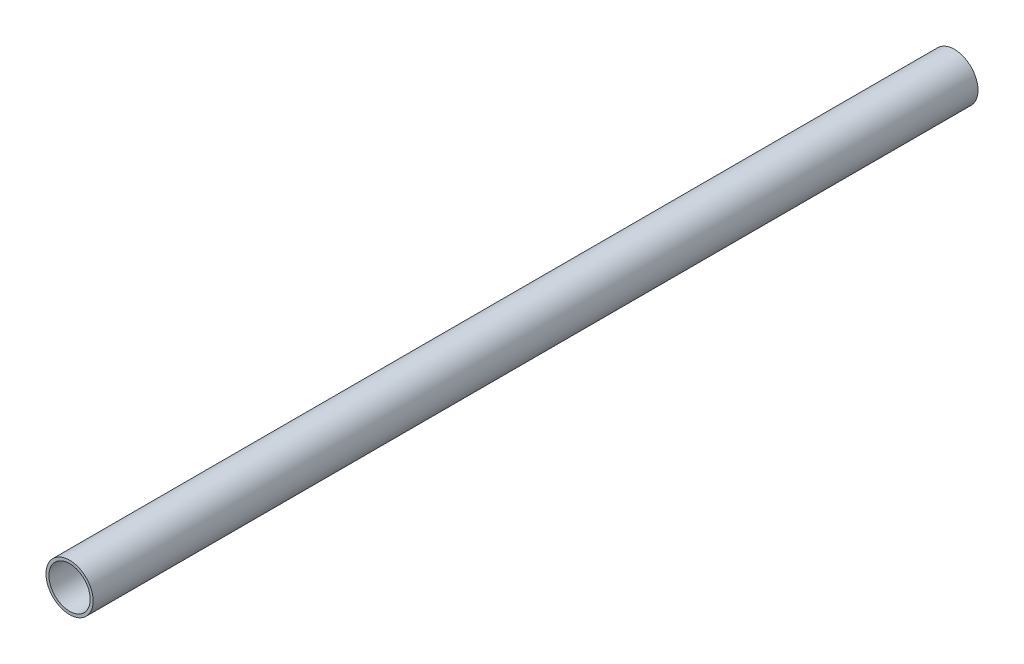
ISO-10303-21;
HEADER;
FILE_DESCRIPTION(('STEP AP214'),'2;1');
FILE_NAME('part.step','',(''),(''),'','','');
FILE_SCHEMA(('AUTOMOTIVE_DESIGN { 1 0 10303 214 1 1 1 1 }'));
ENDSEC;
DATA;
#1=APPLICATION_CONTEXT('core data for automotive mechanical design processes');
#2=APPLICATION_PROTOCOL_DEFINITION('international standard','automotive_design',2000,#1);
#3=PRODUCT_CONTEXT('',#1,'mechanical');
#4=PRODUCT('Part','Part','',(#3));
#5=PRODUCT_RELATED_PRODUCT_CATEGORY('part','',(#4));
#6=PRODUCT_DEFINITION_FORMATION('','',#4);
#7=PRODUCT_DEFINITION_CONTEXT('part definition',#1,'design');
#8=PRODUCT_DEFINITION('design','',#6,#7);
#9=PRODUCT_DEFINITION_SHAPE('','',#8);
#10=(LENGTH_UNIT() NAMED_UNIT(*) SI_UNIT(.MILLI.,.METRE.));
#11=(NAMED_UNIT(*) PLANE_ANGLE_UNIT() SI_UNIT($,.RADIAN.));
#12=(NAMED_UNIT(*) SI_UNIT($,.STERADIAN.) SOLID_ANGLE_UNIT());
#13=UNCERTAINTY_MEASURE_WITH_UNIT(LENGTH_MEASURE(1.E-05),#10,'distance_accuracy_value','');
#14=(GEOMETRIC_REPRESENTATION_CONTEXT(3) GLOBAL_UNCERTAINTY_ASSIGNED_CONTEXT((#13)) GLOBAL_UNIT_ASSIGNED_CONTEXT((#10,
#11,#12)) REPRESENTATION_CONTEXT('',''));
#15=CARTESIAN_POINT('',(0.,0.,0.));
#16=DIRECTION('',(0.,0.,1.));
#17=DIRECTION('',(1.,0.,0.));
#18=AXIS2_PLACEMENT_3D('',#15,#16,#17);
#19=CARTESIAN_POINT('',(0.,0.,75.));
#20=DIRECTION('',(0.,0.,1.));
#21=DIRECTION('',(1.,0.,0.));
#22=AXIS2_PLACEMENT_3D('',#19,#20,#21);
#23=PLANE('',#22);
#24=CARTESIAN_POINT('',(0.,0.,75.));
#25=DIRECTION('',(0.,0.,1.));
#26=DIRECTION('',(1.,0.,0.));
#27=AXIS2_PLACEMENT_3D('',#24,#25,#26);
#28=CIRCLE('',#27,4.);
#29=CARTESIAN_POINT('',(4.,0.,75.));
#30=VERTEX_POINT('',#29);
#31=EDGE_CURVE('E10',#30,#30,#28,.T.);
#32=ORIENTED_EDGE('',*,*,#31,.T.);
#33=EDGE_LOOP('',(#32));
#34=FACE_BOUND('',#33,.T.);
#35=CARTESIAN_POINT('',(0.,0.,75.));
#36=DIRECTION('',(0.,0.,1.));
#37=DIRECTION('',(1.,0.,0.));
#38=AXIS2_PLACEMENT_3D('',#35,#36,#37);
#39=CIRCLE('',#38,3.5);
#40=CARTESIAN_POINT('',(3.5,0.,75.));
#41=VERTEX_POINT('',#40);
#42=EDGE_CURVE('E42',#41,#41,#39,.T.);
#43=ORIENTED_EDGE('',*,*,#42,.F.);
#44=EDGE_LOOP('',(#43));
#45=FACE_BOUND('',#44,.T.);
#46=ADVANCED_FACE('F31',(#34,#45),#23,.T.);
#47=CARTESIAN_POINT('',(0.,0.,-75.));
#48=DIRECTION('',(0.,0.,1.));
#49=DIRECTION('',(1.,0.,0.));
#50=AXIS2_PLACEMENT_3D('',#47,#48,#49);
#51=PLANE('',#50);
#52=CARTESIAN_POINT('',(0.,0.,-75.));
#53=DIRECTION('',(0.,0.,1.));
#54=DIRECTION('',(1.,0.,0.));
#55=AXIS2_PLACEMENT_3D('',#52,#53,#54);
#56=CIRCLE('',#55,4.);
#57=CARTESIAN_POINT('',(4.,0.,-75.));
#58=VERTEX_POINT('',#57);
#59=EDGE_CURVE('E35',#58,#58,#56,.T.);
#60=ORIENTED_EDGE('',*,*,#59,.F.);
#61=EDGE_LOOP('',(#60));
#62=FACE_BOUND('',#61,.T.);
#63=CARTESIAN_POINT('',(0.,0.,-75.));
#64=DIRECTION('',(0.,0.,1.));
#65=DIRECTION('',(1.,0.,0.));
#66=AXIS2_PLACEMENT_3D('',#63,#64,#65);
#67=CIRCLE('',#66,3.5);
#68=CARTESIAN_POINT('',(3.5,0.,-75.));
#69=VERTEX_POINT('',#68);
#70=EDGE_CURVE('E44',#69,#69,#67,.T.);
#71=ORIENTED_EDGE('',*,*,#70,.T.);
#72=EDGE_LOOP('',(#71));
#73=FACE_BOUND('',#72,.T.);
#74=ADVANCED_FACE('F54',(#62,#73),#51,.F.);
#75=CARTESIAN_POINT('',(0.,0.,75.));
#76=DIRECTION('',(0.,0.,-1.));
#77=DIRECTION('',(-1.,0.,0.));
#78=AXIS2_PLACEMENT_3D('',#75,#76,#77);
#79=CYLINDRICAL_SURFACE('',#78,4.);
#80=ORIENTED_EDGE('',*,*,#31,.F.);
#81=EDGE_LOOP('',(#80));
#82=FACE_BOUND('',#81,.T.);
#83=ORIENTED_EDGE('',*,*,#59,.T.);
#84=EDGE_LOOP('',(#83));
#85=FACE_BOUND('',#84,.T.);
#86=ADVANCED_FACE('F33',(#82,#85),#79,.T.);
#87=CARTESIAN_POINT('',(0.,0.,75.));
#88=DIRECTION('',(0.,0.,-1.));
#89=DIRECTION('',(-1.,0.,0.));
#90=AXIS2_PLACEMENT_3D('',#87,#88,#89);
#91=CYLINDRICAL_SURFACE('',#90,3.5);
#92=ORIENTED_EDGE('',*,*,#42,.T.);
#93=EDGE_LOOP('',(#92));
#94=FACE_BOUND('',#93,.T.);
#95=ORIENTED_EDGE('',*,*,#70,.F.);
#96=EDGE_LOOP('',(#95));
#97=FACE_BOUND('',#96,.T.);
#98=ADVANCED_FACE('F50',(#94,#97),#91,.F.);
#99=CLOSED_SHELL('',(#46,#74,#86,#98));
#100=MANIFOLD_SOLID_BREP('B2',#99);
#101=ADVANCED_BREP_SHAPE_REPRESENTATION('',(#18,#100),#14);
#102=SHAPE_DEFINITION_REPRESENTATION(#9,#101);
ENDSEC;
END-ISO-10303-21;
